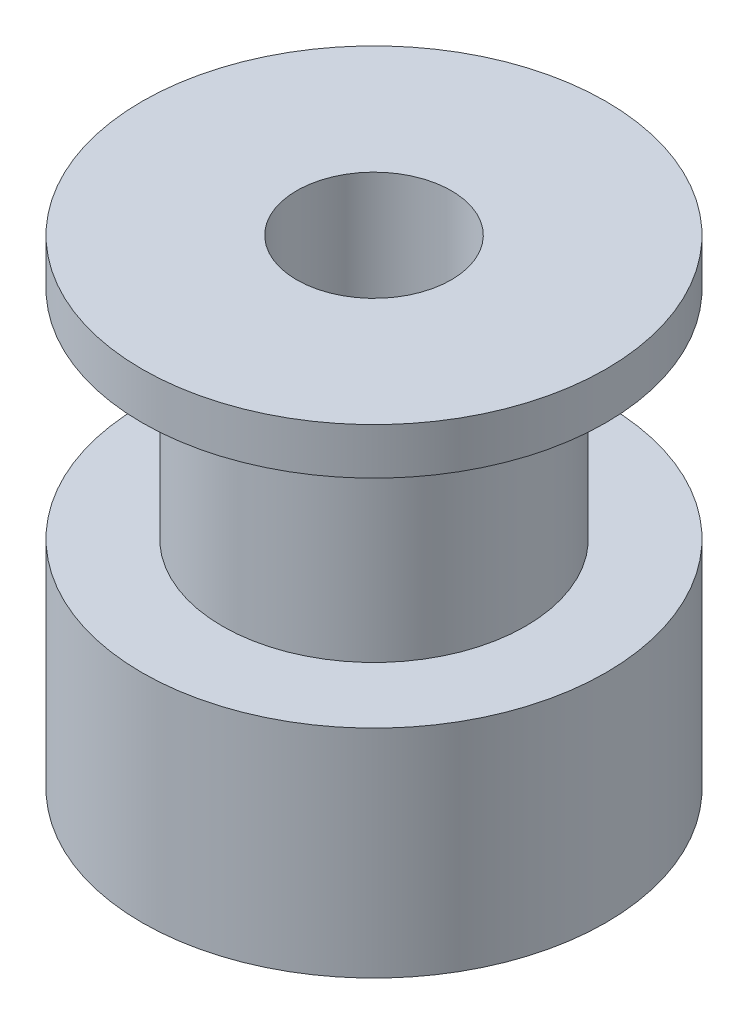
ISO-10303-21;
HEADER;
FILE_DESCRIPTION(('STEP AP214'),'2;1');
FILE_NAME('part.step','',(''),(''),'','','');
FILE_SCHEMA(('AUTOMOTIVE_DESIGN { 1 0 10303 214 1 1 1 1 }'));
ENDSEC;
DATA;
#1=APPLICATION_CONTEXT('core data for automotive mechanical design processes');
#2=APPLICATION_PROTOCOL_DEFINITION('international standard','automotive_design',2000,#1);
#3=PRODUCT_CONTEXT('',#1,'mechanical');
#4=PRODUCT('Part','Part','',(#3));
#5=PRODUCT_RELATED_PRODUCT_CATEGORY('part','',(#4));
#6=PRODUCT_DEFINITION_FORMATION('','',#4);
#7=PRODUCT_DEFINITION_CONTEXT('part definition',#1,'design');
#8=PRODUCT_DEFINITION('design','',#6,#7);
#9=PRODUCT_DEFINITION_SHAPE('','',#8);
#10=(LENGTH_UNIT() NAMED_UNIT(*) SI_UNIT(.MILLI.,.METRE.));
#11=(NAMED_UNIT(*) PLANE_ANGLE_UNIT() SI_UNIT($,.RADIAN.));
#12=(NAMED_UNIT(*) SI_UNIT($,.STERADIAN.) SOLID_ANGLE_UNIT());
#13=UNCERTAINTY_MEASURE_WITH_UNIT(LENGTH_MEASURE(1.E-05),#10,'distance_accuracy_value','');
#14=(GEOMETRIC_REPRESENTATION_CONTEXT(3) GLOBAL_UNCERTAINTY_ASSIGNED_CONTEXT((#13)) GLOBAL_UNIT_ASSIGNED_CONTEXT((#10,
#11,#12)) REPRESENTATION_CONTEXT('',''));
#15=CARTESIAN_POINT('',(0.,0.,0.));
#16=DIRECTION('',(0.,0.,1.));
#17=DIRECTION('',(1.,0.,0.));
#18=AXIS2_PLACEMENT_3D('',#15,#16,#17);
#19=CARTESIAN_POINT('',(0.,7.,0.));
#20=DIRECTION('',(0.,1.,0.));
#21=DIRECTION('',(0.,0.,1.));
#22=AXIS2_PLACEMENT_3D('',#19,#20,#21);
#23=PLANE('',#22);
#24=CARTESIAN_POINT('',(0.,7.,0.));
#25=DIRECTION('',(0.,1.,0.));
#26=DIRECTION('',(0.,0.,1.));
#27=AXIS2_PLACEMENT_3D('',#24,#25,#26);
#28=CIRCLE('',#27,7.5);
#29=CARTESIAN_POINT('',(0.,7.,7.5));
#30=VERTEX_POINT('',#29);
#31=EDGE_CURVE('E10',#30,#30,#28,.T.);
#32=ORIENTED_EDGE('',*,*,#31,.T.);
#33=EDGE_LOOP('',(#32));
#34=FACE_BOUND('',#33,.T.);
#35=CARTESIAN_POINT('',(0.,7.,0.));
#36=DIRECTION('',(0.,1.,0.));
#37=DIRECTION('',(0.,0.,1.));
#38=AXIS2_PLACEMENT_3D('',#35,#36,#37);
#39=CIRCLE('',#38,4.9);
#40=CARTESIAN_POINT('',(0.,7.,4.9));
#41=VERTEX_POINT('',#40);
#42=EDGE_CURVE('E46',#41,#41,#39,.T.);
#43=ORIENTED_EDGE('',*,*,#42,.F.);
#44=EDGE_LOOP('',(#43));
#45=FACE_BOUND('',#44,.T.);
#46=ADVANCED_FACE('F33',(#34,#45),#23,.T.);
#47=CARTESIAN_POINT('',(0.,7.,0.));
#48=DIRECTION('',(0.,-1.,0.));
#49=DIRECTION('',(0.,0.,-1.));
#50=AXIS2_PLACEMENT_3D('',#47,#48,#49);
#51=CYLINDRICAL_SURFACE('',#50,7.5);
#52=ORIENTED_EDGE('',*,*,#31,.F.);
#53=EDGE_LOOP('',(#52));
#54=FACE_BOUND('',#53,.T.);
#55=CARTESIAN_POINT('',(0.,0.,0.));
#56=DIRECTION('',(0.,1.,0.));
#57=DIRECTION('',(0.,0.,1.));
#58=AXIS2_PLACEMENT_3D('',#55,#56,#57);
#59=CIRCLE('',#58,7.5);
#60=CARTESIAN_POINT('',(0.,0.,7.5));
#61=VERTEX_POINT('',#60);
#62=EDGE_CURVE('E37',#61,#61,#59,.T.);
#63=ORIENTED_EDGE('',*,*,#62,.T.);
#64=EDGE_LOOP('',(#63));
#65=FACE_BOUND('',#64,.T.);
#66=ADVANCED_FACE('F35',(#54,#65),#51,.T.);
#67=CARTESIAN_POINT('',(0.,0.,0.));
#68=DIRECTION('',(0.,1.,0.));
#69=DIRECTION('',(0.,0.,1.));
#70=AXIS2_PLACEMENT_3D('',#67,#68,#69);
#71=PLANE('',#70);
#72=CARTESIAN_POINT('',(0.,0.,0.));
#73=DIRECTION('',(0.,1.,0.));
#74=DIRECTION('',(0.,0.,1.));
#75=AXIS2_PLACEMENT_3D('',#72,#73,#74);
#76=CIRCLE('',#75,2.5);
#77=CARTESIAN_POINT('',(0.,0.,2.5));
#78=VERTEX_POINT('',#77);
#79=EDGE_CURVE('E55',#78,#78,#76,.T.);
#80=ORIENTED_EDGE('',*,*,#79,.T.);
#81=EDGE_LOOP('',(#80));
#82=FACE_BOUND('',#81,.T.);
#83=ORIENTED_EDGE('',*,*,#62,.F.);
#84=EDGE_LOOP('',(#83));
#85=FACE_BOUND('',#84,.T.);
#86=ADVANCED_FACE('F64',(#82,#85),#71,.F.);
#87=CARTESIAN_POINT('',(0.,14.,0.));
#88=DIRECTION('',(0.,-1.,0.));
#89=DIRECTION('',(0.,0.,-1.));
#90=AXIS2_PLACEMENT_3D('',#87,#88,#89);
#91=CYLINDRICAL_SURFACE('',#90,4.9);
#92=CARTESIAN_POINT('',(0.,14.,0.));
#93=DIRECTION('',(0.,1.,0.));
#94=DIRECTION('',(0.,0.,1.));
#95=AXIS2_PLACEMENT_3D('',#92,#93,#94);
#96=CIRCLE('',#95,4.9);
#97=CARTESIAN_POINT('',(0.,14.,4.9));
#98=VERTEX_POINT('',#97);
#99=EDGE_CURVE('E44',#98,#98,#96,.T.);
#100=ORIENTED_EDGE('',*,*,#99,.F.);
#101=EDGE_LOOP('',(#100));
#102=FACE_BOUND('',#101,.T.);
#103=ORIENTED_EDGE('',*,*,#42,.T.);
#104=EDGE_LOOP('',(#103));
#105=FACE_BOUND('',#104,.T.);
#106=ADVANCED_FACE('F88',(#102,#105),#91,.T.);
#107=CARTESIAN_POINT('',(0.,14.,0.));
#108=DIRECTION('',(0.,1.,0.));
#109=DIRECTION('',(0.,0.,1.));
#110=AXIS2_PLACEMENT_3D('',#107,#108,#109);
#111=PLANE('',#110);
#112=CARTESIAN_POINT('',(0.,14.,0.));
#113=DIRECTION('',(0.,1.,0.));
#114=DIRECTION('',(0.,0.,1.));
#115=AXIS2_PLACEMENT_3D('',#112,#113,#114);
#116=CIRCLE('',#115,7.5);
#117=CARTESIAN_POINT('',(0.,14.,7.5));
#118=VERTEX_POINT('',#117);
#119=EDGE_CURVE('E52',#118,#118,#116,.T.);
#120=ORIENTED_EDGE('',*,*,#119,.F.);
#121=EDGE_LOOP('',(#120));
#122=FACE_BOUND('',#121,.T.);
#123=ORIENTED_EDGE('',*,*,#99,.T.);
#124=EDGE_LOOP('',(#123));
#125=FACE_BOUND('',#124,.T.);
#126=ADVANCED_FACE('F82',(#122,#125),#111,.F.);
#127=CARTESIAN_POINT('',(0.,15.5,0.));
#128=DIRECTION('',(0.,-1.,0.));
#129=DIRECTION('',(0.,0.,-1.));
#130=AXIS2_PLACEMENT_3D('',#127,#128,#129);
#131=CYLINDRICAL_SURFACE('',#130,7.5);
#132=CARTESIAN_POINT('',(0.,15.5,0.));
#133=DIRECTION('',(0.,1.,0.));
#134=DIRECTION('',(0.,0.,1.));
#135=AXIS2_PLACEMENT_3D('',#132,#133,#134);
#136=CIRCLE('',#135,7.5);
#137=CARTESIAN_POINT('',(0.,15.5,7.5));
#138=VERTEX_POINT('',#137);
#139=EDGE_CURVE('E49',#138,#138,#136,.T.);
#140=ORIENTED_EDGE('',*,*,#139,.F.);
#141=EDGE_LOOP('',(#140));
#142=FACE_BOUND('',#141,.T.);
#143=ORIENTED_EDGE('',*,*,#119,.T.);
#144=EDGE_LOOP('',(#143));
#145=FACE_BOUND('',#144,.T.);
#146=ADVANCED_FACE('F76',(#142,#145),#131,.T.);
#147=CARTESIAN_POINT('',(0.,15.5,0.));
#148=DIRECTION('',(0.,1.,0.));
#149=DIRECTION('',(0.,0.,1.));
#150=AXIS2_PLACEMENT_3D('',#147,#148,#149);
#151=PLANE('',#150);
#152=CARTESIAN_POINT('',(0.,15.5,0.));
#153=DIRECTION('',(0.,1.,0.));
#154=DIRECTION('',(0.,0.,1.));
#155=AXIS2_PLACEMENT_3D('',#152,#153,#154);
#156=CIRCLE('',#155,2.5);
#157=CARTESIAN_POINT('',(0.,15.5,2.5));
#158=VERTEX_POINT('',#157);
#159=EDGE_CURVE('E58',#158,#158,#156,.T.);
#160=ORIENTED_EDGE('',*,*,#159,.F.);
#161=EDGE_LOOP('',(#160));
#162=FACE_BOUND('',#161,.T.);
#163=ORIENTED_EDGE('',*,*,#139,.T.);
#164=EDGE_LOOP('',(#163));
#165=FACE_BOUND('',#164,.T.);
#166=ADVANCED_FACE('F70',(#162,#165),#151,.T.);
#167=CARTESIAN_POINT('',(0.,0.,0.));
#168=DIRECTION('',(0.,1.,0.));
#169=DIRECTION('',(0.,0.,1.));
#170=AXIS2_PLACEMENT_3D('',#167,#168,#169);
#171=CYLINDRICAL_SURFACE('',#170,2.5);
#172=ORIENTED_EDGE('',*,*,#79,.F.);
#173=EDGE_LOOP('',(#172));
#174=FACE_BOUND('',#173,.T.);
#175=ORIENTED_EDGE('',*,*,#159,.T.);
#176=EDGE_LOOP('',(#175));
#177=FACE_BOUND('',#176,.T.);
#178=ADVANCED_FACE('F67',(#174,#177),#171,.F.);
#179=CLOSED_SHELL('',(#46,#66,#86,#106,#126,#146,#166,#178));
#180=MANIFOLD_SOLID_BREP('B2',#179);
#181=ADVANCED_BREP_SHAPE_REPRESENTATION('',(#18,#180),#14);
#182=SHAPE_DEFINITION_REPRESENTATION(#9,#181);
ENDSEC;
END-ISO-10303-21;
